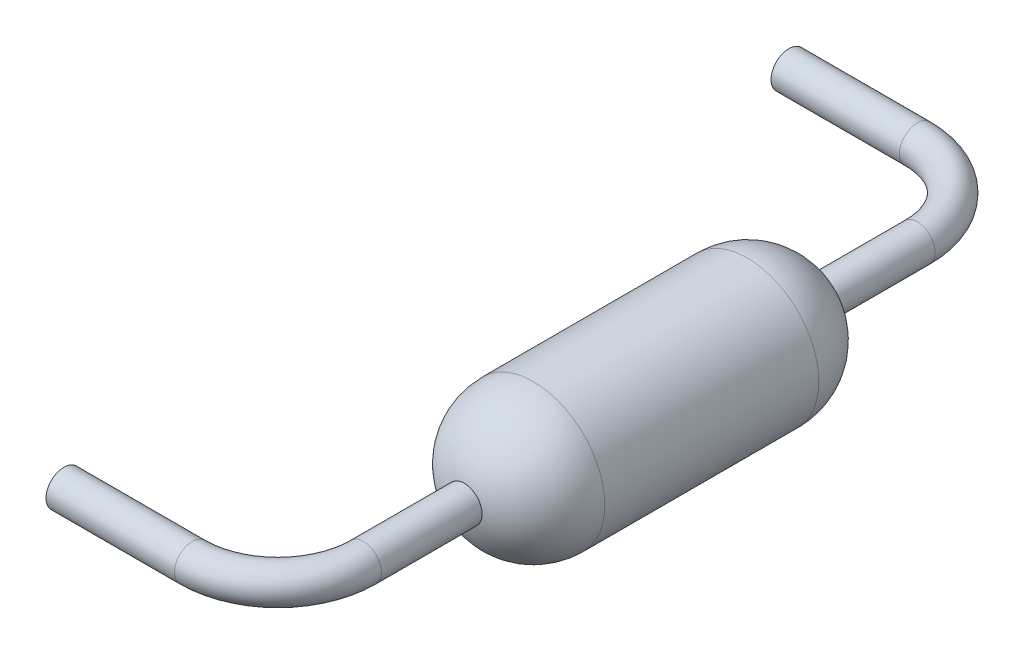
ISO-10303-21;
HEADER;
FILE_DESCRIPTION(('STEP AP214'),'2;1');
FILE_NAME('part.step','',(''),(''),'','','');
FILE_SCHEMA(('AUTOMOTIVE_DESIGN { 1 0 10303 214 1 1 1 1 }'));
ENDSEC;
DATA;
#1=APPLICATION_CONTEXT('core data for automotive mechanical design processes');
#2=APPLICATION_PROTOCOL_DEFINITION('international standard','automotive_design',2000,#1);
#3=PRODUCT_CONTEXT('',#1,'mechanical');
#4=PRODUCT('Part','Part','',(#3));
#5=PRODUCT_RELATED_PRODUCT_CATEGORY('part','',(#4));
#6=PRODUCT_DEFINITION_FORMATION('','',#4);
#7=PRODUCT_DEFINITION_CONTEXT('part definition',#1,'design');
#8=PRODUCT_DEFINITION('design','',#6,#7);
#9=PRODUCT_DEFINITION_SHAPE('','',#8);
#10=(LENGTH_UNIT() NAMED_UNIT(*) SI_UNIT(.MILLI.,.METRE.));
#11=(NAMED_UNIT(*) PLANE_ANGLE_UNIT() SI_UNIT($,.RADIAN.));
#12=(NAMED_UNIT(*) SI_UNIT($,.STERADIAN.) SOLID_ANGLE_UNIT());
#13=UNCERTAINTY_MEASURE_WITH_UNIT(LENGTH_MEASURE(1.E-05),#10,'distance_accuracy_value','');
#14=(GEOMETRIC_REPRESENTATION_CONTEXT(3) GLOBAL_UNCERTAINTY_ASSIGNED_CONTEXT((#13)) GLOBAL_UNIT_ASSIGNED_CONTEXT((#10,
#11,#12)) REPRESENTATION_CONTEXT('',''));
#15=CARTESIAN_POINT('',(0.,0.,0.));
#16=DIRECTION('',(0.,0.,1.));
#17=DIRECTION('',(1.,0.,0.));
#18=AXIS2_PLACEMENT_3D('',#15,#16,#17);
#19=CARTESIAN_POINT('',(0.,0.,1.5));
#20=DIRECTION('',(0.,0.,-1.));
#21=DIRECTION('',(-1.,0.,0.));
#22=AXIS2_PLACEMENT_3D('',#19,#20,#21);
#23=CYLINDRICAL_SURFACE('',#22,1.);
#24=CARTESIAN_POINT('',(0.,0.,1.5));
#25=DIRECTION('',(0.,0.,1.));
#26=DIRECTION('',(1.,0.,0.));
#27=AXIS2_PLACEMENT_3D('',#24,#25,#26);
#28=CIRCLE('',#27,1.);
#29=CARTESIAN_POINT('',(1.,0.,1.5));
#30=VERTEX_POINT('',#29);
#31=EDGE_CURVE('E48',#30,#30,#28,.T.);
#32=ORIENTED_EDGE('',*,*,#31,.F.);
#33=EDGE_LOOP('',(#32));
#34=FACE_BOUND('',#33,.T.);
#35=CARTESIAN_POINT('',(0.,0.,-1.5));
#36=DIRECTION('',(0.,0.,1.));
#37=DIRECTION('',(1.,0.,0.));
#38=AXIS2_PLACEMENT_3D('',#35,#36,#37);
#39=CIRCLE('',#38,1.);
#40=CARTESIAN_POINT('',(1.,0.,-1.5));
#41=VERTEX_POINT('',#40);
#42=EDGE_CURVE('E54',#41,#41,#39,.T.);
#43=ORIENTED_EDGE('',*,*,#42,.T.);
#44=EDGE_LOOP('',(#43));
#45=FACE_BOUND('',#44,.T.);
#46=ADVANCED_FACE('F39',(#34,#45),#23,.T.);
#47=CARTESIAN_POINT('',(0.,0.,1.5));
#48=DIRECTION('',(0.,0.,1.));
#49=DIRECTION('',(1.,0.,0.));
#50=AXIS2_PLACEMENT_3D('',#47,#48,#49);
#51=SPHERICAL_SURFACE('',#50,1.);
#52=CARTESIAN_POINT('',(0.,0.,2.46824583655185));
#53=DIRECTION('',(0.,0.,-1.));
#54=DIRECTION('',(-1.,0.,0.));
#55=AXIS2_PLACEMENT_3D('',#52,#53,#54);
#56=CIRCLE('',#55,0.25);
#57=CARTESIAN_POINT('',(-0.25,0.,2.46824583655185));
#58=VERTEX_POINT('',#57);
#59=EDGE_CURVE('E10',#58,#58,#56,.F.);
#60=ORIENTED_EDGE('',*,*,#59,.F.);
#61=EDGE_LOOP('',(#60));
#62=FACE_BOUND('',#61,.T.);
#63=ORIENTED_EDGE('',*,*,#31,.T.);
#64=EDGE_LOOP('',(#63));
#65=FACE_BOUND('',#64,.T.);
#66=ADVANCED_FACE('F106',(#62,#65),#51,.T.);
#67=CARTESIAN_POINT('',(0.,0.,-1.5));
#68=DIRECTION('',(0.,0.,1.));
#69=DIRECTION('',(1.,0.,0.));
#70=AXIS2_PLACEMENT_3D('',#67,#68,#69);
#71=SPHERICAL_SURFACE('',#70,1.);
#72=CARTESIAN_POINT('',(0.,0.,-2.46824583655185));
#73=DIRECTION('',(0.,0.,1.));
#74=DIRECTION('',(1.,0.,0.));
#75=AXIS2_PLACEMENT_3D('',#72,#73,#74);
#76=CIRCLE('',#75,0.25);
#77=CARTESIAN_POINT('',(0.25,0.,-2.46824583655185));
#78=VERTEX_POINT('',#77);
#79=EDGE_CURVE('E43',#78,#78,#76,.T.);
#80=ORIENTED_EDGE('',*,*,#79,.T.);
#81=EDGE_LOOP('',(#80));
#82=FACE_BOUND('',#81,.T.);
#83=ORIENTED_EDGE('',*,*,#42,.F.);
#84=EDGE_LOOP('',(#83));
#85=FACE_BOUND('',#84,.T.);
#86=ADVANCED_FACE('F41',(#82,#85),#71,.T.);
#87=CARTESIAN_POINT('',(-3.,0.,-5.08));
#88=DIRECTION('',(1.,0.,0.));
#89=DIRECTION('',(0.,0.,-1.));
#90=AXIS2_PLACEMENT_3D('',#87,#88,#89);
#91=PLANE('',#90);
#92=CARTESIAN_POINT('',(-3.,0.,-5.08));
#93=DIRECTION('',(1.,0.,0.));
#94=DIRECTION('',(0.,0.,-1.));
#95=AXIS2_PLACEMENT_3D('',#92,#93,#94);
#96=CIRCLE('',#95,0.25);
#97=CARTESIAN_POINT('',(-3.,0.,-5.33));
#98=VERTEX_POINT('',#97);
#99=EDGE_CURVE('E89',#98,#98,#96,.T.);
#100=ORIENTED_EDGE('',*,*,#99,.F.);
#101=EDGE_LOOP('',(#100));
#102=FACE_BOUND('',#101,.T.);
#103=ADVANCED_FACE('F96',(#102),#91,.F.);
#104=CARTESIAN_POINT('',(-3.,0.,-5.08));
#105=DIRECTION('',(1.,0.,0.));
#106=DIRECTION('',(0.,0.,-1.));
#107=AXIS2_PLACEMENT_3D('',#104,#105,#106);
#108=CYLINDRICAL_SURFACE('',#107,0.25);
#109=CARTESIAN_POINT('',(-1.2,0.,-5.08));
#110=DIRECTION('',(1.,0.,0.));
#111=DIRECTION('',(0.,0.,-1.));
#112=AXIS2_PLACEMENT_3D('',#109,#110,#111);
#113=CIRCLE('',#112,0.25);
#114=CARTESIAN_POINT('',(-1.2,0.,-5.33));
#115=VERTEX_POINT('',#114);
#116=EDGE_CURVE('E85',#115,#115,#113,.T.);
#117=ORIENTED_EDGE('',*,*,#116,.F.);
#118=EDGE_LOOP('',(#117));
#119=FACE_BOUND('',#118,.T.);
#120=ORIENTED_EDGE('',*,*,#99,.T.);
#121=EDGE_LOOP('',(#120));
#122=FACE_BOUND('',#121,.T.);
#123=ADVANCED_FACE('F94',(#119,#122),#108,.T.);
#124=CARTESIAN_POINT('',(-1.2,0.,-3.88));
#125=DIRECTION('',(0.,-1.,0.));
#126=DIRECTION('',(0.,0.,-1.));
#127=AXIS2_PLACEMENT_3D('',#124,#125,#126);
#128=TOROIDAL_SURFACE('',#127,1.2,0.25);
#129=CARTESIAN_POINT('',(0.,0.,-3.88));
#130=DIRECTION('',(0.,0.,1.));
#131=DIRECTION('',(1.,0.,0.));
#132=AXIS2_PLACEMENT_3D('',#129,#130,#131);
#133=CIRCLE('',#132,0.25);
#134=CARTESIAN_POINT('',(0.250000000000001,0.,-3.88));
#135=VERTEX_POINT('',#134);
#136=EDGE_CURVE('E79',#135,#135,#133,.T.);
#137=CARTESIAN_POINT('',(-1.2,0.,-3.88));
#138=DIRECTION('',(0.,-1.,0.));
#139=DIRECTION('',(0.,0.,-1.));
#140=AXIS2_PLACEMENT_3D('',#137,#138,#139);
#141=CIRCLE('',#140,1.45);
#142=EDGE_CURVE('',#115,#135,#141,.T.);
#143=ORIENTED_EDGE('',*,*,#116,.T.);
#144=ORIENTED_EDGE('',*,*,#136,.F.);
#145=ORIENTED_EDGE('',*,*,#142,.T.);
#146=ORIENTED_EDGE('',*,*,#142,.F.);
#147=EDGE_LOOP('',(#143,#145,#144,#146));
#148=FACE_BOUND('',#147,.T.);
#149=ADVANCED_FACE('F103',(#148),#128,.T.);
#150=CARTESIAN_POINT('',(0.,0.,-3.88));
#151=DIRECTION('',(0.,0.,1.));
#152=DIRECTION('',(1.,0.,0.));
#153=AXIS2_PLACEMENT_3D('',#150,#151,#152);
#154=CYLINDRICAL_SURFACE('',#153,0.25);
#155=ORIENTED_EDGE('',*,*,#136,.T.);
#156=EDGE_LOOP('',(#155));
#157=FACE_BOUND('',#156,.T.);
#158=ORIENTED_EDGE('',*,*,#79,.F.);
#159=EDGE_LOOP('',(#158));
#160=FACE_BOUND('',#159,.T.);
#161=ADVANCED_FACE('F142',(#157,#160),#154,.T.);
#162=CARTESIAN_POINT('',(-3.,0.,5.08));
#163=DIRECTION('',(-1.,0.,0.));
#164=DIRECTION('',(0.,0.,1.));
#165=AXIS2_PLACEMENT_3D('',#162,#163,#164);
#166=PLANE('',#165);
#167=CARTESIAN_POINT('',(-3.,0.,5.08));
#168=DIRECTION('',(-1.,0.,0.));
#169=DIRECTION('',(0.,0.,1.));
#170=AXIS2_PLACEMENT_3D('',#167,#168,#169);
#171=CIRCLE('',#170,0.25);
#172=CARTESIAN_POINT('',(-3.,0.,5.33));
#173=VERTEX_POINT('',#172);
#174=EDGE_CURVE('E57',#173,#173,#171,.T.);
#175=ORIENTED_EDGE('',*,*,#174,.T.);
#176=EDGE_LOOP('',(#175));
#177=FACE_BOUND('',#176,.T.);
#178=ADVANCED_FACE('F152',(#177),#166,.T.);
#179=ORIENTED_EDGE('',*,*,#59,.T.);
#180=EDGE_LOOP('',(#179));
#181=FACE_BOUND('',#180,.T.);
#182=CARTESIAN_POINT('',(0.,0.,3.88));
#183=DIRECTION('',(0.,0.,1.));
#184=DIRECTION('',(1.,0.,0.));
#185=AXIS2_PLACEMENT_3D('',#182,#183,#184);
#186=CIRCLE('',#185,0.25);
#187=CARTESIAN_POINT('',(0.250000000000001,0.,3.88));
#188=VERTEX_POINT('',#187);
#189=EDGE_CURVE('E74',#188,#188,#186,.T.);
#190=ORIENTED_EDGE('',*,*,#189,.F.);
#191=EDGE_LOOP('',(#190));
#192=FACE_BOUND('',#191,.T.);
#193=ADVANCED_FACE('F155',(#181,#192),#154,.T.);
#194=CARTESIAN_POINT('',(-1.2,0.,3.88));
#195=DIRECTION('',(0.,-1.,0.));
#196=DIRECTION('',(0.,0.,-1.));
#197=AXIS2_PLACEMENT_3D('',#194,#195,#196);
#198=TOROIDAL_SURFACE('',#197,1.2,0.25);
#199=CARTESIAN_POINT('',(-1.2,0.,5.08));
#200=DIRECTION('',(-1.,0.,0.));
#201=DIRECTION('',(0.,0.,1.));
#202=AXIS2_PLACEMENT_3D('',#199,#200,#201);
#203=CIRCLE('',#202,0.25);
#204=CARTESIAN_POINT('',(-1.2,0.,5.33));
#205=VERTEX_POINT('',#204);
#206=EDGE_CURVE('E69',#205,#205,#203,.T.);
#207=CARTESIAN_POINT('',(-1.2,0.,3.88));
#208=DIRECTION('',(0.,-1.,0.));
#209=DIRECTION('',(0.,0.,-1.));
#210=AXIS2_PLACEMENT_3D('',#207,#208,#209);
#211=CIRCLE('',#210,1.45);
#212=EDGE_CURVE('',#188,#205,#211,.T.);
#213=ORIENTED_EDGE('',*,*,#189,.T.);
#214=ORIENTED_EDGE('',*,*,#206,.F.);
#215=ORIENTED_EDGE('',*,*,#212,.T.);
#216=ORIENTED_EDGE('',*,*,#212,.F.);
#217=EDGE_LOOP('',(#213,#215,#214,#216));
#218=FACE_BOUND('',#217,.T.);
#219=ADVANCED_FACE('F171',(#218),#198,.T.);
#220=CARTESIAN_POINT('',(-1.2,0.,5.08));
#221=DIRECTION('',(-1.,0.,0.));
#222=DIRECTION('',(0.,0.,1.));
#223=AXIS2_PLACEMENT_3D('',#220,#221,#222);
#224=CYLINDRICAL_SURFACE('',#223,0.25);
#225=ORIENTED_EDGE('',*,*,#174,.F.);
#226=EDGE_LOOP('',(#225));
#227=FACE_BOUND('',#226,.T.);
#228=ORIENTED_EDGE('',*,*,#206,.T.);
#229=EDGE_LOOP('',(#228));
#230=FACE_BOUND('',#229,.T.);
#231=ADVANCED_FACE('F156',(#227,#230),#224,.T.);
#232=CLOSED_SHELL('',(#46,#66,#86,#103,#123,#149,#161,#178,#193,#219,#231));
#233=MANIFOLD_SOLID_BREP('B2',#232);
#234=ADVANCED_BREP_SHAPE_REPRESENTATION('',(#18,#233),#14);
#235=SHAPE_DEFINITION_REPRESENTATION(#9,#234);
ENDSEC;
END-ISO-10303-21;
